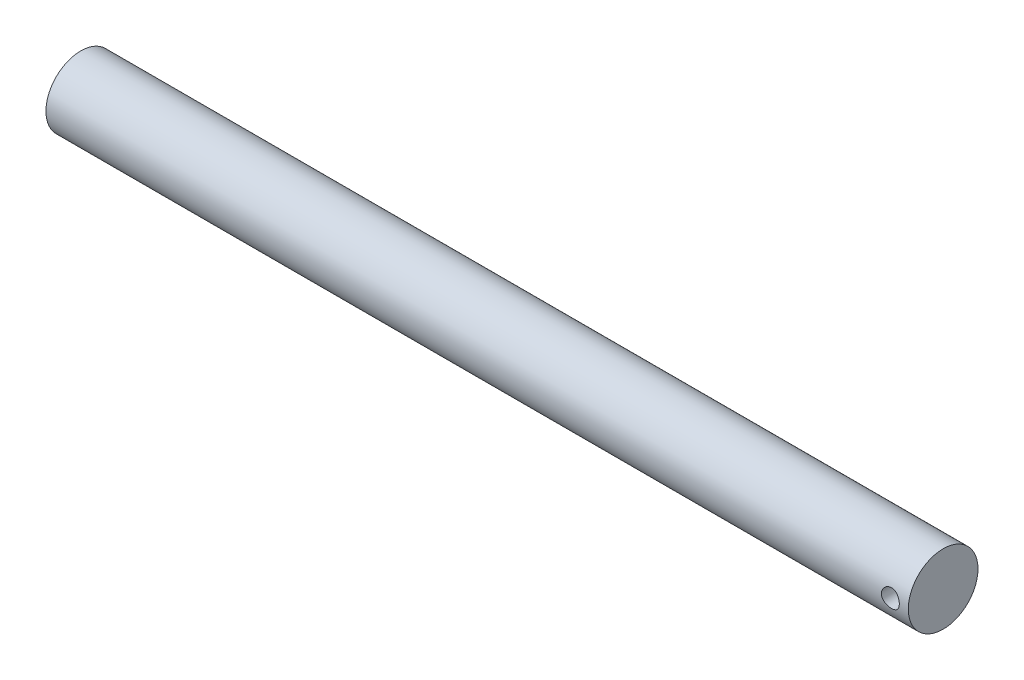
ISO-10303-21;
HEADER;
FILE_DESCRIPTION(('STEP AP214'),'2;1');
FILE_NAME('part.step','',(''),(''),'','','');
FILE_SCHEMA(('AUTOMOTIVE_DESIGN { 1 0 10303 214 1 1 1 1 }'));
ENDSEC;
DATA;
#1=APPLICATION_CONTEXT('core data for automotive mechanical design processes');
#2=APPLICATION_PROTOCOL_DEFINITION('international standard','automotive_design',2000,#1);
#3=PRODUCT_CONTEXT('',#1,'mechanical');
#4=PRODUCT('Part','Part','',(#3));
#5=PRODUCT_RELATED_PRODUCT_CATEGORY('part','',(#4));
#6=PRODUCT_DEFINITION_FORMATION('','',#4);
#7=PRODUCT_DEFINITION_CONTEXT('part definition',#1,'design');
#8=PRODUCT_DEFINITION('design','',#6,#7);
#9=PRODUCT_DEFINITION_SHAPE('','',#8);
#10=(LENGTH_UNIT() NAMED_UNIT(*) SI_UNIT(.MILLI.,.METRE.));
#11=(NAMED_UNIT(*) PLANE_ANGLE_UNIT() SI_UNIT($,.RADIAN.));
#12=(NAMED_UNIT(*) SI_UNIT($,.STERADIAN.) SOLID_ANGLE_UNIT());
#13=UNCERTAINTY_MEASURE_WITH_UNIT(LENGTH_MEASURE(1.E-05),#10,'distance_accuracy_value','');
#14=(GEOMETRIC_REPRESENTATION_CONTEXT(3) GLOBAL_UNCERTAINTY_ASSIGNED_CONTEXT((#13)) GLOBAL_UNIT_ASSIGNED_CONTEXT((#10,
#11,#12)) REPRESENTATION_CONTEXT('',''));
#15=CARTESIAN_POINT('',(0.,0.,0.));
#16=DIRECTION('',(0.,0.,1.));
#17=DIRECTION('',(1.,0.,0.));
#18=AXIS2_PLACEMENT_3D('',#15,#16,#17);
#19=CARTESIAN_POINT('',(150.153932581996,-1.46491708715051E-07,1.62913714496867E-07));
#20=DIRECTION('',(-1.,0.,0.));
#21=DIRECTION('',(0.,0.,1.));
#22=AXIS2_PLACEMENT_3D('',#19,#20,#21);
#23=CYLINDRICAL_SURFACE('',#22,7.275);
#24=CARTESIAN_POINT('',(148.278932581996,-1.46491708715051E-07,-7.27499983708628));
#25=CARTESIAN_POINT('',(148.278929874548,0.103489265815382,-7.27499816495929));
#26=CARTESIAN_POINT('',(148.270335754638,0.207008340591947,-7.27276969900612));
#27=CARTESIAN_POINT('',(148.236242093559,0.411072663928138,-7.26409605869197));
#28=CARTESIAN_POINT('',(148.2107336324,0.511616314119219,-7.25764865944765));
#29=CARTESIAN_POINT('',(148.143689440405,0.706754032462706,-7.24125004136104));
#30=CARTESIAN_POINT('',(148.102173606984,0.801355317967254,-7.23130317375169));
#31=CARTESIAN_POINT('',(148.004364882846,0.982251489793319,-7.20896123870912));
#32=CARTESIAN_POINT('',(147.948071269046,1.06854596937635,-7.19656605148579));
#33=CARTESIAN_POINT('',(147.821009972784,1.23225867317803,-7.17036786627845));
#34=CARTESIAN_POINT('',(147.749980622637,1.30947016978875,-7.15654206688085));
#35=CARTESIAN_POINT('',(147.596023948221,1.45102738213522,-7.12919005800725));
#36=CARTESIAN_POINT('',(147.513095198758,1.51537155453654,-7.11566388464185));
#37=CARTESIAN_POINT('',(147.336068106286,1.6303561400702,-7.09021121698454));
#38=CARTESIAN_POINT('',(147.241813082005,1.68076230436472,-7.07831358902645));
#39=CARTESIAN_POINT('',(147.045810543213,1.76493252818803,-7.05779888590655));
#40=CARTESIAN_POINT('',(146.94406431317,1.79869943313527,-7.04918124990281));
#41=CARTESIAN_POINT('',(146.738248281292,1.84792156676529,-7.03643708902655));
#42=CARTESIAN_POINT('',(146.63427350813,1.86374992881982,-7.03221920077002));
#43=CARTESIAN_POINT('',(146.425065378306,1.87780840639942,-7.028478856847));
#44=CARTESIAN_POINT('',(146.319832243336,1.87604157743556,-7.02895558593172));
#45=CARTESIAN_POINT('',(146.113978180217,1.85525685809159,-7.03446864568327));
#46=CARTESIAN_POINT('',(146.013308375535,1.83668671071288,-7.03938662755678));
#47=CARTESIAN_POINT('',(145.816563660465,1.78353805035277,-7.05303904709453));
#48=CARTESIAN_POINT('',(145.720489096277,1.74895833332171,-7.06177377180606));
#49=CARTESIAN_POINT('',(145.534476786846,1.6643982303877,-7.0821820308898));
#50=CARTESIAN_POINT('',(145.444615223006,1.61425787983786,-7.0938858483994));
#51=CARTESIAN_POINT('',(145.274422230539,1.50011155435849,-7.11889684678366));
#52=CARTESIAN_POINT('',(145.194092569584,1.43610301380279,-7.13220432413425));
#53=CARTESIAN_POINT('',(145.042681274314,1.29373166341515,-7.15941894694222));
#54=CARTESIAN_POINT('',(144.97195473402,1.21499184782818,-7.17333202826741));
#55=CARTESIAN_POINT('',(144.844640211896,1.04660076739916,-7.19982657213103));
#56=CARTESIAN_POINT('',(144.788052717042,0.956949126890778,-7.21240798879575));
#57=CARTESIAN_POINT('',(144.690480442396,0.768752913818113,-7.23489079270868));
#58=CARTESIAN_POINT('',(144.64955634048,0.670175550669257,-7.24478171541018));
#59=CARTESIAN_POINT('',(144.584961266988,0.467227885247282,-7.26069322728109));
#60=CARTESIAN_POINT('',(144.561286781379,0.362858767515152,-7.26671460471134));
#61=CARTESIAN_POINT('',(144.532412221015,0.154323697374968,-7.27409076031621));
#62=CARTESIAN_POINT('',(144.526728944644,0.0502288672958175,-7.27556756396766));
#63=CARTESIAN_POINT('',(144.532668670586,-0.157425411510535,-7.27403722389218));
#64=CARTESIAN_POINT('',(144.544290010272,-0.26098491071304,-7.27103051094144));
#65=CARTESIAN_POINT('',(144.584111644562,-0.462928974048919,-7.26094946240612));
#66=CARTESIAN_POINT('',(144.612045634091,-0.5613696122947,-7.25394050361309));
#67=CARTESIAN_POINT('',(144.68339313419,-0.752160587225684,-7.23664712232906));
#68=CARTESIAN_POINT('',(144.726808262646,-0.844510286170014,-7.22636235750575));
#69=CARTESIAN_POINT('',(144.828803693813,-1.02239993298845,-7.20336878897047));
#70=CARTESIAN_POINT('',(144.887651090746,-1.10778123852481,-7.19061844994294));
#71=CARTESIAN_POINT('',(145.018501787803,-1.26762761171626,-7.16416907330352));
#72=CARTESIAN_POINT('',(145.090507508417,-1.34209066639568,-7.15046986143367));
#73=CARTESIAN_POINT('',(145.24787990198,-1.4799987138059,-7.12322299288236));
#74=CARTESIAN_POINT('',(145.333547274104,-1.54310381022073,-7.10968871696682));
#75=CARTESIAN_POINT('',(145.514538016535,-1.65404565791738,-7.08470200284884));
#76=CARTESIAN_POINT('',(145.609860966629,-1.70188307327501,-7.07324947410904));
#77=CARTESIAN_POINT('',(145.806958972063,-1.78057233333305,-7.05385203691528));
#78=CARTESIAN_POINT('',(145.908691943001,-1.81152423997343,-7.04588652159077));
#79=CARTESIAN_POINT('',(146.116156401829,-1.85581632406057,-7.03435162295355));
#80=CARTESIAN_POINT('',(146.221886942922,-1.86916064519974,-7.03078120533098));
#81=CARTESIAN_POINT('',(146.430877016595,-1.87763214128894,-7.02852308181625));
#82=CARTESIAN_POINT('',(146.534113238485,-1.87330392500722,-7.02968939949739));
#83=CARTESIAN_POINT('',(146.738330376057,-1.8478073396245,-7.03643387630767));
#84=CARTESIAN_POINT('',(146.839311342651,-1.82663935107882,-7.0420119357376));
#85=CARTESIAN_POINT('',(147.035516784457,-1.76837004726445,-7.0568674708505));
#86=CARTESIAN_POINT('',(147.130775430659,-1.73137693503874,-7.06611979379135));
#87=CARTESIAN_POINT('',(147.313804146716,-1.64259222711671,-7.08728350201621));
#88=CARTESIAN_POINT('',(147.401573112006,-1.5907984535237,-7.09919527857866));
#89=CARTESIAN_POINT('',(147.569748140395,-1.47220128348101,-7.1247467666126));
#90=CARTESIAN_POINT('',(147.649883884289,-1.40502283284726,-7.13842511657835));
#91=CARTESIAN_POINT('',(147.797921992316,-1.25828612322111,-7.16574482224877));
#92=CARTESIAN_POINT('',(147.865821417491,-1.17872489862283,-7.17938616829286));
#93=CARTESIAN_POINT('',(147.988760957813,-1.00760070796015,-7.20541395878204));
#94=CARTESIAN_POINT('',(148.043523209379,-0.915833222636622,-7.21777059703584));
#95=CARTESIAN_POINT('',(148.136756395917,-0.724081962886318,-7.23951717666897));
#96=CARTESIAN_POINT('',(148.175238452844,-0.624103853554428,-7.24890914227257));
#97=CARTESIAN_POINT('',(148.229421158917,-0.436991483001317,-7.26235860185664));
#98=CARTESIAN_POINT('',(148.247946464154,-0.350711040718934,-7.26706560682285));
#99=CARTESIAN_POINT('',(148.272702803846,-0.176294183237972,-7.27338680456407));
#100=CARTESIAN_POINT('',(148.278934888343,-0.0881579272062443,-7.27500126149291));
#101=CARTESIAN_POINT('',(148.278932581996,-1.46491708715051E-07,-7.27499983708628));
#102=B_SPLINE_CURVE_WITH_KNOTS('',3,(#24,#25,#26,#27,#28,#29,#30,#31,#32,#33,#34,#35,#36,#37,
#38,#39,#40,#41,#42,#43,#44,#45,#46,#47,#48,#49,#50,#51,#52,#53,#54,#55,#56,#57,#58,#59,#60,#61,
#62,#63,#64,#65,#66,#67,#68,#69,#70,#71,#72,#73,#74,#75,#76,#77,#78,#79,#80,#81,#82,#83,#84,#85,
#86,#87,#88,#89,#90,#91,#92,#93,#94,#95,#96,#97,#98,#99,#100,#101),.UNSPECIFIED.,.T.,.F.,(4,2,2,
2,2,2,2,2,2,2,2,2,2,2,2,2,2,2,2,2,2,2,2,2,2,2,2,2,2,2,2,2,2,2,2,2,2,2,4),(0.,0.310145066201006,
0.620453821481817,0.930378095142211,1.24031753637465,1.55632172879943,1.87236380074125,
2.19343279199984,2.51444685936278,2.82865348807054,3.14280555385312,3.44882551367846,
3.75486849242978,4.0641681083525,4.37352499388319,4.69228012322293,5.01104622959512,
5.33103498723576,5.65095853963536,5.96221343182306,6.27343842057352,6.57971930789566,
6.88603221306647,7.19804348500643,7.51011220969197,7.83035940792579,8.15059267494047,
8.46890706601096,8.78714653299181,9.09565410542723,9.40415470622079,9.71057885079131,
10.0170481084866,10.3319820477553,10.6469915283539,10.9681698537719,11.2891284077727,
11.5533490256622,11.8175470738134),.UNSPECIFIED.);
#103=CARTESIAN_POINT('',(148.278932581996,-1.46491708715051E-07,-7.27499983708628));
#104=VERTEX_POINT('',#103);
#105=EDGE_CURVE('E10',#104,#104,#102,.T.);
#106=ORIENTED_EDGE('',*,*,#105,.T.);
#107=EDGE_LOOP('',(#106));
#108=FACE_BOUND('',#107,.T.);
#109=CARTESIAN_POINT('',(148.278932581996,-1.46491708715051E-07,7.27500016291372));
#110=CARTESIAN_POINT('',(148.278929874548,-0.103489558798799,7.27499849078672));
#111=CARTESIAN_POINT('',(148.270335754638,-0.207008633575365,7.27277002483355));
#112=CARTESIAN_POINT('',(148.236242093559,-0.411072956911555,7.2640963845194));
#113=CARTESIAN_POINT('',(148.2107336324,-0.511616607102637,7.25764898527508));
#114=CARTESIAN_POINT('',(148.143689440405,-0.706754325446124,7.24125036718847));
#115=CARTESIAN_POINT('',(148.102173606984,-0.801355610950671,7.23130349957912));
#116=CARTESIAN_POINT('',(148.004364882846,-0.982251782776736,7.20896156453655));
#117=CARTESIAN_POINT('',(147.948071269046,-1.06854626235977,7.19656637731322));
#118=CARTESIAN_POINT('',(147.821009972784,-1.23225896616145,7.17036819210588));
#119=CARTESIAN_POINT('',(147.749980622637,-1.30947046277217,7.15654239270827));
#120=CARTESIAN_POINT('',(147.596023948221,-1.45102767511864,7.12919038383468));
#121=CARTESIAN_POINT('',(147.513095198758,-1.51537184751995,7.11566421046928));
#122=CARTESIAN_POINT('',(147.336068106286,-1.63035643305362,7.09021154281197));
#123=CARTESIAN_POINT('',(147.241813082005,-1.68076259734814,7.07831391485388));
#124=CARTESIAN_POINT('',(147.045810543213,-1.76493282117145,7.05779921173398));
#125=CARTESIAN_POINT('',(146.94406431317,-1.79869972611869,7.04918157573024));
#126=CARTESIAN_POINT('',(146.738248281292,-1.84792185974871,7.03643741485398));
#127=CARTESIAN_POINT('',(146.63427350813,-1.86375022180324,7.03221952659745));
#128=CARTESIAN_POINT('',(146.425065378306,-1.87780869938284,7.02847918267443));
#129=CARTESIAN_POINT('',(146.319832243336,-1.87604187041898,7.02895591175915));
#130=CARTESIAN_POINT('',(146.113978180217,-1.85525715107501,7.0344689715107));
#131=CARTESIAN_POINT('',(146.013308375535,-1.8366870036963,7.0393869533842));
#132=CARTESIAN_POINT('',(145.816563660465,-1.78353834333619,7.05303937292196));
#133=CARTESIAN_POINT('',(145.720489096277,-1.74895862630512,7.06177409763349));
#134=CARTESIAN_POINT('',(145.534476786846,-1.66439852337112,7.08218235671723));
#135=CARTESIAN_POINT('',(145.444615223006,-1.61425817282128,7.09388617422683));
#136=CARTESIAN_POINT('',(145.274422230539,-1.50011184734191,7.11889717261109));
#137=CARTESIAN_POINT('',(145.194092569584,-1.43610330678621,7.13220464996168));
#138=CARTESIAN_POINT('',(145.042681274314,-1.29373195639856,7.15941927276965));
#139=CARTESIAN_POINT('',(144.97195473402,-1.2149921408116,7.17333235409484));
#140=CARTESIAN_POINT('',(144.844640211896,-1.04660106038258,7.19982689795846));
#141=CARTESIAN_POINT('',(144.788052717042,-0.956949419874195,7.21240831462318));
#142=CARTESIAN_POINT('',(144.690480442396,-0.76875320680153,7.2348911185361));
#143=CARTESIAN_POINT('',(144.64955634048,-0.670175843652674,7.24478204123761));
#144=CARTESIAN_POINT('',(144.584961266988,-0.467228178230699,7.26069355310852));
#145=CARTESIAN_POINT('',(144.561286781379,-0.362859060498569,7.26671493053877));
#146=CARTESIAN_POINT('',(144.532412221015,-0.154323990358385,7.27409108614364));
#147=CARTESIAN_POINT('',(144.526728944644,-0.0502291602792352,7.27556788979509));
#148=CARTESIAN_POINT('',(144.532668670586,0.157425118527118,7.27403754971961));
#149=CARTESIAN_POINT('',(144.544290010272,0.260984617729623,7.27103083676887));
#150=CARTESIAN_POINT('',(144.584111644562,0.462928681065502,7.26094978823355));
#151=CARTESIAN_POINT('',(144.612045634091,0.561369319311282,7.25394082944052));
#152=CARTESIAN_POINT('',(144.68339313419,0.752160294242267,7.23664744815649));
#153=CARTESIAN_POINT('',(144.726808262646,0.844509993186597,7.22636268333318));
#154=CARTESIAN_POINT('',(144.828803693813,1.02239964000503,7.2033691147979));
#155=CARTESIAN_POINT('',(144.887651090746,1.10778094554139,7.19061877577036));
#156=CARTESIAN_POINT('',(145.018501787803,1.26762731873284,7.16416939913095));
#157=CARTESIAN_POINT('',(145.090507508417,1.34209037341226,7.1504701872611));
#158=CARTESIAN_POINT('',(145.24787990198,1.47999842082248,7.12322331870979));
#159=CARTESIAN_POINT('',(145.333547274104,1.54310351723731,7.10968904279425));
#160=CARTESIAN_POINT('',(145.514538016535,1.65404536493396,7.08470232867627));
#161=CARTESIAN_POINT('',(145.609860966629,1.70188278029159,7.07324979993647));
#162=CARTESIAN_POINT('',(145.806958972063,1.78057204034964,7.05385236274271));
#163=CARTESIAN_POINT('',(145.908691943001,1.81152394699002,7.0458868474182));
#164=CARTESIAN_POINT('',(146.116156401829,1.85581603107716,7.03435194878098));
#165=CARTESIAN_POINT('',(146.221886942922,1.86916035221633,7.03078153115841));
#166=CARTESIAN_POINT('',(146.430877016595,1.87763184830552,7.02852340764368));
#167=CARTESIAN_POINT('',(146.534113238485,1.8733036320238,7.02968972532481));
#168=CARTESIAN_POINT('',(146.738330376057,1.84780704664108,7.03643420213509));
#169=CARTESIAN_POINT('',(146.839311342651,1.8266390580954,7.04201226156503));
#170=CARTESIAN_POINT('',(147.035516784457,1.76836975428103,7.05686779667793));
#171=CARTESIAN_POINT('',(147.130775430659,1.73137664205532,7.06612011961878));
#172=CARTESIAN_POINT('',(147.313804146716,1.6425919341333,7.08728382784364));
#173=CARTESIAN_POINT('',(147.401573112006,1.59079816054028,7.09919560440609));
#174=CARTESIAN_POINT('',(147.569748140395,1.47220099049759,7.12474709244003));
#175=CARTESIAN_POINT('',(147.649883884289,1.40502253986384,7.13842544240578));
#176=CARTESIAN_POINT('',(147.797921992316,1.25828583023769,7.16574514807619));
#177=CARTESIAN_POINT('',(147.865821417491,1.17872460563941,7.17938649412029));
#178=CARTESIAN_POINT('',(147.988760957813,1.00760041497674,7.20541428460947));
#179=CARTESIAN_POINT('',(148.043523209379,0.915832929653204,7.21777092286327));
#180=CARTESIAN_POINT('',(148.136756395917,0.7240816699029,7.2395175024964));
#181=CARTESIAN_POINT('',(148.175238452844,0.624103560571011,7.2489094681));
#182=CARTESIAN_POINT('',(148.229421158917,0.4369911900179,7.26235892768407));
#183=CARTESIAN_POINT('',(148.247946464154,0.350710747735516,7.26706593265028));
#184=CARTESIAN_POINT('',(148.272702803846,0.176293890254554,7.2733871303915));
#185=CARTESIAN_POINT('',(148.278934888343,0.0881576342228269,7.27500158732034));
#186=CARTESIAN_POINT('',(148.278932581996,-1.46491708715051E-07,7.27500016291372));
#187=B_SPLINE_CURVE_WITH_KNOTS('',3,(#109,#110,#111,#112,#113,#114,#115,#116,#117,#118,#119,
#120,#121,#122,#123,#124,#125,#126,#127,#128,#129,#130,#131,#132,#133,#134,#135,#136,#137,#138,
#139,#140,#141,#142,#143,#144,#145,#146,#147,#148,#149,#150,#151,#152,#153,#154,#155,#156,#157,
#158,#159,#160,#161,#162,#163,#164,#165,#166,#167,#168,#169,#170,#171,#172,#173,#174,#175,#176,
#177,#178,#179,#180,#181,#182,#183,#184,#185,#186),.UNSPECIFIED.,.T.,.F.,(4,2,2,2,2,2,2,2,2,2,2,
2,2,2,2,2,2,2,2,2,2,2,2,2,2,2,2,2,2,2,2,2,2,2,2,2,2,2,4),(0.,0.310145066201006,
0.620453821481817,0.930378095142211,1.24031753637465,1.55632172879943,1.87236380074125,
2.19343279199984,2.51444685936278,2.82865348807054,3.14280555385312,3.44882551367846,
3.75486849242978,4.0641681083525,4.37352499388319,4.69228012322293,5.01104622959512,
5.33103498723576,5.65095853963536,5.96221343182306,6.27343842057351,6.57971930789566,
6.88603221306647,7.19804348500643,7.51011220969196,7.83035940792579,8.15059267494046,
8.46890706601096,8.78714653299181,9.09565410542723,9.40415470622079,9.71057885079131,
10.0170481084866,10.3319820477553,10.6469915283539,10.9681698537719,11.2891284077727,
11.5533490256622,11.8175470738134),.UNSPECIFIED.);
#188=CARTESIAN_POINT('',(148.278932581996,-1.46491708715051E-07,7.27500016291372));
#189=VERTEX_POINT('',#188);
#190=EDGE_CURVE('E43',#189,#189,#187,.T.);
#191=ORIENTED_EDGE('',*,*,#190,.T.);
#192=EDGE_LOOP('',(#191));
#193=FACE_BOUND('',#192,.T.);
#194=CARTESIAN_POINT('',(150.153932581996,-1.46491708715051E-07,1.62913714496867E-07));
#195=DIRECTION('',(1.,0.,0.));
#196=DIRECTION('',(0.,0.,-1.));
#197=AXIS2_PLACEMENT_3D('',#194,#195,#196);
#198=CIRCLE('',#197,7.275);
#199=CARTESIAN_POINT('',(150.153932581996,-1.46491708715051E-07,-7.27499983708629));
#200=VERTEX_POINT('',#199);
#201=EDGE_CURVE('E47',#200,#200,#198,.T.);
#202=ORIENTED_EDGE('',*,*,#201,.F.);
#203=EDGE_LOOP('',(#202));
#204=FACE_BOUND('',#203,.T.);
#205=CARTESIAN_POINT('',(-29.8460674180045,-1.46491708715051E-07,1.62913714496867E-07));
#206=DIRECTION('',(1.,0.,0.));
#207=DIRECTION('',(0.,0.,-1.));
#208=AXIS2_PLACEMENT_3D('',#205,#206,#207);
#209=CIRCLE('',#208,7.275);
#210=CARTESIAN_POINT('',(-29.8460674180045,-1.46491708715051E-07,-7.27499983708629));
#211=VERTEX_POINT('',#210);
#212=EDGE_CURVE('E51',#211,#211,#209,.T.);
#213=ORIENTED_EDGE('',*,*,#212,.T.);
#214=EDGE_LOOP('',(#213));
#215=FACE_BOUND('',#214,.T.);
#216=ADVANCED_FACE('F32',(#108,#193,#204,#215),#23,.T.);
#217=CARTESIAN_POINT('',(150.153932581996,-1.46491708715051E-07,1.62913714496867E-07));
#218=DIRECTION('',(1.,0.,0.));
#219=DIRECTION('',(0.,0.,-1.));
#220=AXIS2_PLACEMENT_3D('',#217,#218,#219);
#221=PLANE('',#220);
#222=ORIENTED_EDGE('',*,*,#201,.T.);
#223=EDGE_LOOP('',(#222));
#224=FACE_BOUND('',#223,.T.);
#225=ADVANCED_FACE('F63',(#224),#221,.T.);
#226=CARTESIAN_POINT('',(-29.8460674180045,-1.46491708715051E-07,1.62913714496867E-07));
#227=DIRECTION('',(1.,0.,0.));
#228=DIRECTION('',(0.,0.,-1.));
#229=AXIS2_PLACEMENT_3D('',#226,#227,#228);
#230=PLANE('',#229);
#231=ORIENTED_EDGE('',*,*,#212,.F.);
#232=EDGE_LOOP('',(#231));
#233=FACE_BOUND('',#232,.T.);
#234=ADVANCED_FACE('F61',(#233),#230,.F.);
#235=CARTESIAN_POINT('',(146.403932581996,-1.46491708715051E-07,-7.27499983708628));
#236=DIRECTION('',(0.,0.,1.));
#237=DIRECTION('',(1.,0.,0.));
#238=AXIS2_PLACEMENT_3D('',#235,#236,#237);
#239=CYLINDRICAL_SURFACE('',#238,1.87500000000002);
#240=ORIENTED_EDGE('',*,*,#190,.F.);
#241=EDGE_LOOP('',(#240));
#242=FACE_BOUND('',#241,.T.);
#243=ORIENTED_EDGE('',*,*,#105,.F.);
#244=EDGE_LOOP('',(#243));
#245=FACE_BOUND('',#244,.T.);
#246=ADVANCED_FACE('F57',(#242,#245),#239,.F.);
#247=CLOSED_SHELL('',(#216,#225,#234,#246));
#248=MANIFOLD_SOLID_BREP('B2',#247);
#249=ADVANCED_BREP_SHAPE_REPRESENTATION('',(#18,#248),#14);
#250=SHAPE_DEFINITION_REPRESENTATION(#9,#249);
ENDSEC;
END-ISO-10303-21;
